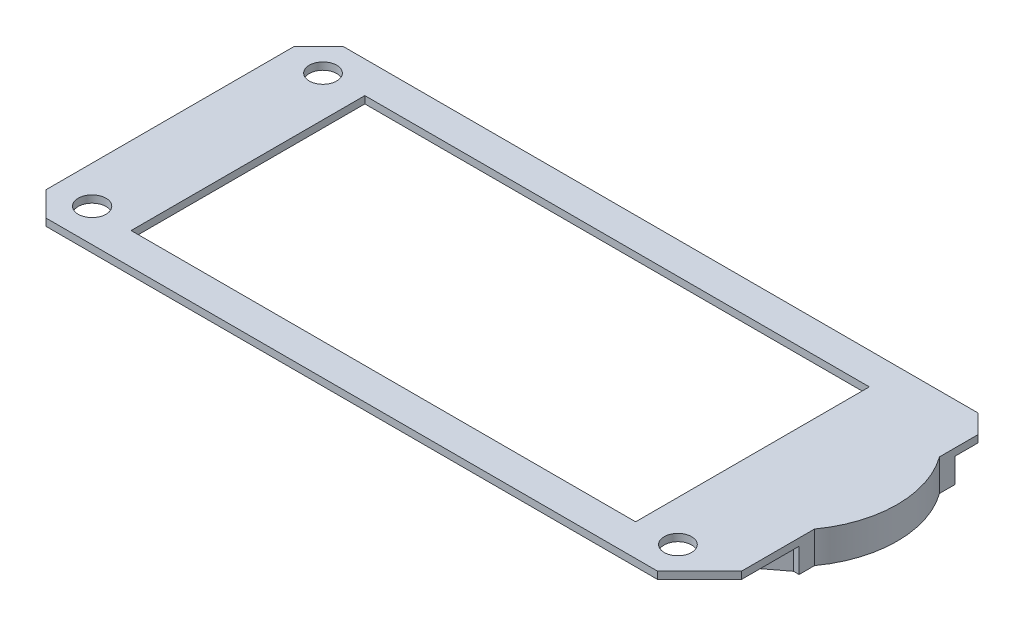
ISO-10303-21;
HEADER;
FILE_DESCRIPTION(('STEP AP214'),'2;1');
FILE_NAME('part.step','',(''),(''),'','','');
FILE_SCHEMA(('AUTOMOTIVE_DESIGN { 1 0 10303 214 1 1 1 1 }'));
ENDSEC;
DATA;
#1=APPLICATION_CONTEXT('core data for automotive mechanical design processes');
#2=APPLICATION_PROTOCOL_DEFINITION('international standard','automotive_design',2000,#1);
#3=PRODUCT_CONTEXT('',#1,'mechanical');
#4=PRODUCT('Part','Part','',(#3));
#5=PRODUCT_RELATED_PRODUCT_CATEGORY('part','',(#4));
#6=PRODUCT_DEFINITION_FORMATION('','',#4);
#7=PRODUCT_DEFINITION_CONTEXT('part definition',#1,'design');
#8=PRODUCT_DEFINITION('design','',#6,#7);
#9=PRODUCT_DEFINITION_SHAPE('','',#8);
#10=(LENGTH_UNIT() NAMED_UNIT(*) SI_UNIT(.MILLI.,.METRE.));
#11=(NAMED_UNIT(*) PLANE_ANGLE_UNIT() SI_UNIT($,.RADIAN.));
#12=(NAMED_UNIT(*) SI_UNIT($,.STERADIAN.) SOLID_ANGLE_UNIT());
#13=UNCERTAINTY_MEASURE_WITH_UNIT(LENGTH_MEASURE(1.E-05),#10,'distance_accuracy_value','');
#14=(GEOMETRIC_REPRESENTATION_CONTEXT(3) GLOBAL_UNCERTAINTY_ASSIGNED_CONTEXT((#13)) GLOBAL_UNIT_ASSIGNED_CONTEXT((#10,
#11,#12)) REPRESENTATION_CONTEXT('',''));
#15=CARTESIAN_POINT('',(0.,0.,0.));
#16=DIRECTION('',(0.,0.,1.));
#17=DIRECTION('',(1.,0.,0.));
#18=AXIS2_PLACEMENT_3D('',#15,#16,#17);
#19=CARTESIAN_POINT('',(-19.3118277968053,0.5,0.));
#20=DIRECTION('',(1.,0.,0.));
#21=DIRECTION('',(0.,0.,-1.));
#22=AXIS2_PLACEMENT_3D('',#19,#20,#21);
#23=PLANE('',#22);
#24=DIRECTION('',(0.,0.,1.));
#25=VECTOR('',#24,1.);
#26=CARTESIAN_POINT('',(-19.3118277968053,0.,0.));
#27=LINE('',#26,#25);
#28=CARTESIAN_POINT('',(-19.3118277968053,0.,-8.35591389840265));
#29=VERTEX_POINT('',#28);
#30=CARTESIAN_POINT('',(-19.3118277968053,0.,7.84408610159735));
#31=VERTEX_POINT('',#30);
#32=EDGE_CURVE('E390',#29,#31,#27,.T.);
#33=ORIENTED_EDGE('',*,*,#32,.F.);
#34=DIRECTION('',(0.,-1.,0.));
#35=VECTOR('',#34,1.);
#36=CARTESIAN_POINT('',(-19.3118277968053,0.5,-8.35591389840265));
#37=LINE('',#36,#35);
#38=CARTESIAN_POINT('',(-19.3118277968053,0.5,-8.35591389840265));
#39=VERTEX_POINT('',#38);
#40=EDGE_CURVE('E11',#39,#29,#37,.T.);
#41=ORIENTED_EDGE('',*,*,#40,.F.);
#42=DIRECTION('',(0.,0.,1.));
#43=VECTOR('',#42,1.);
#44=CARTESIAN_POINT('',(-19.3118277968053,0.5,0.));
#45=LINE('',#44,#43);
#46=CARTESIAN_POINT('',(-19.3118277968053,0.5,7.84408610159735));
#47=VERTEX_POINT('',#46);
#48=EDGE_CURVE('E361',#39,#47,#45,.T.);
#49=ORIENTED_EDGE('',*,*,#48,.T.);
#50=DIRECTION('',(0.,-1.,0.));
#51=VECTOR('',#50,1.);
#52=CARTESIAN_POINT('',(-19.3118277968053,0.5,7.84408610159735));
#53=LINE('',#52,#51);
#54=EDGE_CURVE('E225',#47,#31,#53,.T.);
#55=ORIENTED_EDGE('',*,*,#54,.T.);
#56=EDGE_LOOP('',(#33,#41,#49,#55));
#57=FACE_BOUND('',#56,.T.);
#58=ADVANCED_FACE('F37',(#57),#23,.T.);
#59=CARTESIAN_POINT('',(0.,0.5,-8.35591389840265));
#60=DIRECTION('',(0.,0.,1.));
#61=DIRECTION('',(1.,0.,0.));
#62=AXIS2_PLACEMENT_3D('',#59,#60,#61);
#63=PLANE('',#62);
#64=DIRECTION('',(-1.,0.,0.));
#65=VECTOR('',#64,1.);
#66=CARTESIAN_POINT('',(0.,0.,-8.35591389840265));
#67=LINE('',#66,#65);
#68=CARTESIAN_POINT('',(15.6554741861121,0.,-8.35591389840265));
#69=VERTEX_POINT('',#68);
#70=EDGE_CURVE('E393',#69,#29,#67,.T.);
#71=ORIENTED_EDGE('',*,*,#70,.F.);
#72=DIRECTION('',(0.,-1.,0.));
#73=VECTOR('',#72,1.);
#74=CARTESIAN_POINT('',(15.6554741861121,0.5,-8.35591389840265));
#75=LINE('',#74,#73);
#76=CARTESIAN_POINT('',(15.6554741861121,0.5,-8.35591389840265));
#77=VERTEX_POINT('',#76);
#78=EDGE_CURVE('E46',#77,#69,#75,.T.);
#79=ORIENTED_EDGE('',*,*,#78,.F.);
#80=DIRECTION('',(-1.,0.,0.));
#81=VECTOR('',#80,1.);
#82=CARTESIAN_POINT('',(0.,0.5,-8.35591389840265));
#83=LINE('',#82,#81);
#84=EDGE_CURVE('E364',#77,#39,#83,.T.);
#85=ORIENTED_EDGE('',*,*,#84,.T.);
#86=ORIENTED_EDGE('',*,*,#40,.T.);
#87=EDGE_LOOP('',(#71,#79,#85,#86));
#88=FACE_BOUND('',#87,.T.);
#89=ADVANCED_FACE('F528',(#88),#63,.T.);
#90=CARTESIAN_POINT('',(15.6554741861121,0.5,0.));
#91=DIRECTION('',(1.,0.,0.));
#92=DIRECTION('',(0.,0.,-1.));
#93=AXIS2_PLACEMENT_3D('',#90,#91,#92);
#94=PLANE('',#93);
#95=DIRECTION('',(0.,0.,1.));
#96=VECTOR('',#95,1.);
#97=CARTESIAN_POINT('',(15.6554741861121,0.,0.));
#98=LINE('',#97,#96);
#99=CARTESIAN_POINT('',(15.6554741861121,0.,7.84408610159735));
#100=VERTEX_POINT('',#99);
#101=EDGE_CURVE('E396',#69,#100,#98,.T.);
#102=ORIENTED_EDGE('',*,*,#101,.T.);
#103=DIRECTION('',(0.,-1.,0.));
#104=VECTOR('',#103,1.);
#105=CARTESIAN_POINT('',(15.6554741861121,0.5,7.84408610159735));
#106=LINE('',#105,#104);
#107=CARTESIAN_POINT('',(15.6554741861121,0.5,7.84408610159735));
#108=VERTEX_POINT('',#107);
#109=EDGE_CURVE('E402',#108,#100,#106,.T.);
#110=ORIENTED_EDGE('',*,*,#109,.F.);
#111=DIRECTION('',(0.,0.,1.));
#112=VECTOR('',#111,1.);
#113=CARTESIAN_POINT('',(15.6554741861121,0.5,0.));
#114=LINE('',#113,#112);
#115=EDGE_CURVE('E367',#77,#108,#114,.T.);
#116=ORIENTED_EDGE('',*,*,#115,.F.);
#117=ORIENTED_EDGE('',*,*,#78,.T.);
#118=EDGE_LOOP('',(#102,#110,#116,#117));
#119=FACE_BOUND('',#118,.T.);
#120=ADVANCED_FACE('F533',(#119),#94,.F.);
#121=CARTESIAN_POINT('',(22.2881722031947,0.5,0.));
#122=DIRECTION('',(-1.,0.,0.));
#123=DIRECTION('',(0.,0.,1.));
#124=AXIS2_PLACEMENT_3D('',#121,#122,#123);
#125=PLANE('',#124);
#126=DIRECTION('',(0.,0.,-1.));
#127=VECTOR('',#126,1.);
#128=CARTESIAN_POINT('',(22.2881722031947,0.,0.));
#129=LINE('',#128,#127);
#130=CARTESIAN_POINT('',(22.2881722031947,0.,7.14408610159735));
#131=VERTEX_POINT('',#130);
#132=CARTESIAN_POINT('',(22.2881722031947,0.,3.14408610159735));
#133=VERTEX_POINT('',#132);
#134=EDGE_CURVE('E307',#131,#133,#129,.T.);
#135=ORIENTED_EDGE('',*,*,#134,.T.);
#136=DIRECTION('',(0.,1.,0.));
#137=VECTOR('',#136,1.);
#138=CARTESIAN_POINT('',(22.2881722031947,-1.7,3.14408610159735));
#139=LINE('',#138,#137);
#140=CARTESIAN_POINT('',(22.2881722031947,-1.7,3.14408610159735));
#141=VERTEX_POINT('',#140);
#142=EDGE_CURVE('E238',#141,#133,#139,.T.);
#143=ORIENTED_EDGE('',*,*,#142,.F.);
#144=DIRECTION('',(0.,0.,-1.));
#145=VECTOR('',#144,1.);
#146=CARTESIAN_POINT('',(22.2881722031947,-1.7,0.));
#147=LINE('',#146,#145);
#148=CARTESIAN_POINT('',(22.2881722031947,-1.7,2.07536766713885));
#149=VERTEX_POINT('',#148);
#150=EDGE_CURVE('E231',#141,#149,#147,.T.);
#151=ORIENTED_EDGE('',*,*,#150,.T.);
#152=DIRECTION('',(0.,-1.,0.));
#153=VECTOR('',#152,1.);
#154=CARTESIAN_POINT('',(22.2881722031947,0.5,2.07536766713885));
#155=LINE('',#154,#153);
#156=CARTESIAN_POINT('',(22.2881722031947,0.5,2.07536766713885));
#157=VERTEX_POINT('',#156);
#158=EDGE_CURVE('E41',#157,#149,#155,.T.);
#159=ORIENTED_EDGE('',*,*,#158,.F.);
#160=DIRECTION('',(0.,0.,-1.));
#161=VECTOR('',#160,1.);
#162=CARTESIAN_POINT('',(22.2881722031947,0.5,0.));
#163=LINE('',#162,#161);
#164=CARTESIAN_POINT('',(22.2881722031947,0.5,7.14408610159735));
#165=VERTEX_POINT('',#164);
#166=EDGE_CURVE('E341',#165,#157,#163,.T.);
#167=ORIENTED_EDGE('',*,*,#166,.F.);
#168=DIRECTION('',(0.,-1.,0.));
#169=VECTOR('',#168,1.);
#170=CARTESIAN_POINT('',(22.2881722031947,0.5,7.14408610159735));
#171=LINE('',#170,#169);
#172=EDGE_CURVE('E372',#165,#131,#171,.T.);
#173=ORIENTED_EDGE('',*,*,#172,.T.);
#174=EDGE_LOOP('',(#135,#143,#151,#159,#167,#173));
#175=FACE_BOUND('',#174,.T.);
#176=ADVANCED_FACE('F39',(#175),#125,.F.);
#177=CARTESIAN_POINT('',(16.2881722031947,0.5,-2.25591389840268));
#178=DIRECTION('',(0.,-1.,0.));
#179=DIRECTION('',(0.,0.,-1.));
#180=AXIS2_PLACEMENT_3D('',#177,#178,#179);
#181=CYLINDRICAL_SURFACE('',#180,7.39999999999999);
#182=ORIENTED_EDGE('',*,*,#158,.T.);
#183=CARTESIAN_POINT('',(16.2881722031947,-1.7,-2.25591389840268));
#184=DIRECTION('',(0.,1.,0.));
#185=DIRECTION('',(0.,0.,1.));
#186=AXIS2_PLACEMENT_3D('',#183,#184,#185);
#187=CIRCLE('',#186,7.39999999999999);
#188=CARTESIAN_POINT('',(22.2881722031947,-1.7,-6.58719546394421));
#189=VERTEX_POINT('',#188);
#190=EDGE_CURVE('E219',#149,#189,#187,.T.);
#191=ORIENTED_EDGE('',*,*,#190,.T.);
#192=DIRECTION('',(0.,-1.,0.));
#193=VECTOR('',#192,1.);
#194=CARTESIAN_POINT('',(22.2881722031947,0.5,-6.58719546394421));
#195=LINE('',#194,#193);
#196=CARTESIAN_POINT('',(22.2881722031947,0.5,-6.58719546394421));
#197=VERTEX_POINT('',#196);
#198=EDGE_CURVE('E226',#197,#189,#195,.T.);
#199=ORIENTED_EDGE('',*,*,#198,.F.);
#200=CARTESIAN_POINT('',(16.2881722031947,0.5,-2.25591389840268));
#201=DIRECTION('',(0.,1.,0.));
#202=DIRECTION('',(0.,0.,1.));
#203=AXIS2_PLACEMENT_3D('',#200,#201,#202);
#204=CIRCLE('',#203,7.39999999999999);
#205=EDGE_CURVE('E220',#157,#197,#204,.T.);
#206=ORIENTED_EDGE('',*,*,#205,.F.);
#207=EDGE_LOOP('',(#182,#191,#199,#206));
#208=FACE_BOUND('',#207,.T.);
#209=ADVANCED_FACE('F217',(#208),#181,.T.);
#210=CARTESIAN_POINT('',(22.2881722031947,0.5,0.));
#211=DIRECTION('',(-1.,0.,0.));
#212=DIRECTION('',(0.,0.,1.));
#213=AXIS2_PLACEMENT_3D('',#210,#211,#212);
#214=PLANE('',#213);
#215=ORIENTED_EDGE('',*,*,#198,.T.);
#216=DIRECTION('',(0.,0.,1.));
#217=VECTOR('',#216,1.);
#218=CARTESIAN_POINT('',(22.2881722031947,-1.7,0.));
#219=LINE('',#218,#217);
#220=CARTESIAN_POINT('',(22.2881722031947,-1.7,-7.65591389840265));
#221=VERTEX_POINT('',#220);
#222=EDGE_CURVE('E234',#221,#189,#219,.T.);
#223=ORIENTED_EDGE('',*,*,#222,.F.);
#224=DIRECTION('',(0.,1.,0.));
#225=VECTOR('',#224,1.);
#226=CARTESIAN_POINT('',(22.2881722031947,-1.7,-7.65591389840265));
#227=LINE('',#226,#225);
#228=CARTESIAN_POINT('',(22.2881722031947,0.,-7.65591389840265));
#229=VERTEX_POINT('',#228);
#230=EDGE_CURVE('E284',#221,#229,#227,.T.);
#231=ORIENTED_EDGE('',*,*,#230,.T.);
#232=DIRECTION('',(0.,0.,-1.));
#233=VECTOR('',#232,1.);
#234=CARTESIAN_POINT('',(22.2881722031947,0.,0.));
#235=LINE('',#234,#233);
#236=CARTESIAN_POINT('',(22.2881722031947,0.,-9.25591389840265));
#237=VERTEX_POINT('',#236);
#238=EDGE_CURVE('E374',#229,#237,#235,.T.);
#239=ORIENTED_EDGE('',*,*,#238,.T.);
#240=DIRECTION('',(0.,-1.,0.));
#241=VECTOR('',#240,1.);
#242=CARTESIAN_POINT('',(22.2881722031947,0.5,-9.25591389840265));
#243=LINE('',#242,#241);
#244=CARTESIAN_POINT('',(22.2881722031947,0.5,-9.25591389840265));
#245=VERTEX_POINT('',#244);
#246=EDGE_CURVE('E426',#245,#237,#243,.T.);
#247=ORIENTED_EDGE('',*,*,#246,.F.);
#248=DIRECTION('',(0.,0.,-1.));
#249=VECTOR('',#248,1.);
#250=CARTESIAN_POINT('',(22.2881722031947,0.5,0.));
#251=LINE('',#250,#249);
#252=EDGE_CURVE('E345',#197,#245,#251,.T.);
#253=ORIENTED_EDGE('',*,*,#252,.F.);
#254=EDGE_LOOP('',(#215,#223,#231,#239,#247,#253));
#255=FACE_BOUND('',#254,.T.);
#256=ADVANCED_FACE('F430',(#255),#214,.F.);
#257=CARTESIAN_POINT('',(15.7720430507987,0.5,-15.7720430507987));
#258=DIRECTION('',(-0.707106781186547,0.,0.707106781186548));
#259=DIRECTION('',(0.707106781186548,0.,0.707106781186547));
#260=AXIS2_PLACEMENT_3D('',#257,#258,#259);
#261=PLANE('',#260);
#262=DIRECTION('',(-0.707106781186548,0.,-0.707106781186547));
#263=VECTOR('',#262,1.);
#264=CARTESIAN_POINT('',(15.7720430507987,0.,-15.7720430507987));
#265=LINE('',#264,#263);
#266=CARTESIAN_POINT('',(20.9881722031947,0.,-10.5559138984027));
#267=VERTEX_POINT('',#266);
#268=EDGE_CURVE('E376',#237,#267,#265,.T.);
#269=ORIENTED_EDGE('',*,*,#268,.T.);
#270=DIRECTION('',(0.,-1.,0.));
#271=VECTOR('',#270,1.);
#272=CARTESIAN_POINT('',(20.9881722031947,0.5,-10.5559138984027));
#273=LINE('',#272,#271);
#274=CARTESIAN_POINT('',(20.9881722031947,0.5,-10.5559138984027));
#275=VERTEX_POINT('',#274);
#276=EDGE_CURVE('E423',#275,#267,#273,.T.);
#277=ORIENTED_EDGE('',*,*,#276,.F.);
#278=DIRECTION('',(-0.707106781186548,0.,-0.707106781186547));
#279=VECTOR('',#278,1.);
#280=CARTESIAN_POINT('',(15.7720430507987,0.5,-15.7720430507987));
#281=LINE('',#280,#279);
#282=EDGE_CURVE('E347',#245,#275,#281,.T.);
#283=ORIENTED_EDGE('',*,*,#282,.F.);
#284=ORIENTED_EDGE('',*,*,#246,.T.);
#285=EDGE_LOOP('',(#269,#277,#283,#284));
#286=FACE_BOUND('',#285,.T.);
#287=ADVANCED_FACE('F490',(#286),#261,.F.);
#288=CARTESIAN_POINT('',(0.,0.5,-10.5559138984027));
#289=DIRECTION('',(0.,0.,1.));
#290=DIRECTION('',(1.,0.,0.));
#291=AXIS2_PLACEMENT_3D('',#288,#289,#290);
#292=PLANE('',#291);
#293=DIRECTION('',(-1.,0.,0.));
#294=VECTOR('',#293,1.);
#295=CARTESIAN_POINT('',(0.,0.,-10.5559138984027));
#296=LINE('',#295,#294);
#297=CARTESIAN_POINT('',(-23.0118277968053,0.,-10.5559138984027));
#298=VERTEX_POINT('',#297);
#299=EDGE_CURVE('E378',#267,#298,#296,.T.);
#300=ORIENTED_EDGE('',*,*,#299,.T.);
#301=DIRECTION('',(0.,-1.,0.));
#302=VECTOR('',#301,1.);
#303=CARTESIAN_POINT('',(-23.0118277968053,0.5,-10.5559138984027));
#304=LINE('',#303,#302);
#305=CARTESIAN_POINT('',(-23.0118277968053,0.5,-10.5559138984027));
#306=VERTEX_POINT('',#305);
#307=EDGE_CURVE('E420',#306,#298,#304,.T.);
#308=ORIENTED_EDGE('',*,*,#307,.F.);
#309=DIRECTION('',(-1.,0.,0.));
#310=VECTOR('',#309,1.);
#311=CARTESIAN_POINT('',(0.,0.5,-10.5559138984027));
#312=LINE('',#311,#310);
#313=EDGE_CURVE('E349',#275,#306,#312,.T.);
#314=ORIENTED_EDGE('',*,*,#313,.F.);
#315=ORIENTED_EDGE('',*,*,#276,.T.);
#316=EDGE_LOOP('',(#300,#308,#314,#315));
#317=FACE_BOUND('',#316,.T.);
#318=ADVANCED_FACE('F496',(#317),#292,.F.);
#319=CARTESIAN_POINT('',(-16.7838708476039,0.5,-16.783870847604));
#320=DIRECTION('',(0.707106781186547,0.,0.707106781186548));
#321=DIRECTION('',(0.707106781186548,0.,-0.707106781186547));
#322=AXIS2_PLACEMENT_3D('',#319,#320,#321);
#323=PLANE('',#322);
#324=DIRECTION('',(-0.707106781186548,0.,0.707106781186547));
#325=VECTOR('',#324,1.);
#326=CARTESIAN_POINT('',(-16.7838708476039,0.,-16.783870847604));
#327=LINE('',#326,#325);
#328=CARTESIAN_POINT('',(-24.7118277968053,0.,-8.85591389840265));
#329=VERTEX_POINT('',#328);
#330=EDGE_CURVE('E380',#298,#329,#327,.T.);
#331=ORIENTED_EDGE('',*,*,#330,.T.);
#332=DIRECTION('',(0.,-1.,0.));
#333=VECTOR('',#332,1.);
#334=CARTESIAN_POINT('',(-24.7118277968053,0.5,-8.85591389840265));
#335=LINE('',#334,#333);
#336=CARTESIAN_POINT('',(-24.7118277968053,0.5,-8.85591389840265));
#337=VERTEX_POINT('',#336);
#338=EDGE_CURVE('E417',#337,#329,#335,.T.);
#339=ORIENTED_EDGE('',*,*,#338,.F.);
#340=DIRECTION('',(-0.707106781186548,0.,0.707106781186547));
#341=VECTOR('',#340,1.);
#342=CARTESIAN_POINT('',(-16.7838708476039,0.5,-16.783870847604));
#343=LINE('',#342,#341);
#344=EDGE_CURVE('E351',#306,#337,#343,.T.);
#345=ORIENTED_EDGE('',*,*,#344,.F.);
#346=ORIENTED_EDGE('',*,*,#307,.T.);
#347=EDGE_LOOP('',(#331,#339,#345,#346));
#348=FACE_BOUND('',#347,.T.);
#349=ADVANCED_FACE('F500',(#348),#323,.F.);
#350=CARTESIAN_POINT('',(-24.7118277968053,0.5,0.));
#351=DIRECTION('',(1.,0.,0.));
#352=DIRECTION('',(0.,0.,-1.));
#353=AXIS2_PLACEMENT_3D('',#350,#351,#352);
#354=PLANE('',#353);
#355=DIRECTION('',(0.,0.,1.));
#356=VECTOR('',#355,1.);
#357=CARTESIAN_POINT('',(-24.7118277968053,0.,0.));
#358=LINE('',#357,#356);
#359=CARTESIAN_POINT('',(-24.7118277968053,0.,8.34408610159735));
#360=VERTEX_POINT('',#359);
#361=EDGE_CURVE('E382',#329,#360,#358,.T.);
#362=ORIENTED_EDGE('',*,*,#361,.T.);
#363=DIRECTION('',(0.,-1.,0.));
#364=VECTOR('',#363,1.);
#365=CARTESIAN_POINT('',(-24.7118277968053,0.5,8.34408610159735));
#366=LINE('',#365,#364);
#367=CARTESIAN_POINT('',(-24.7118277968053,0.5,8.34408610159735));
#368=VERTEX_POINT('',#367);
#369=EDGE_CURVE('E414',#368,#360,#366,.T.);
#370=ORIENTED_EDGE('',*,*,#369,.F.);
#371=DIRECTION('',(0.,0.,1.));
#372=VECTOR('',#371,1.);
#373=CARTESIAN_POINT('',(-24.7118277968053,0.5,0.));
#374=LINE('',#373,#372);
#375=EDGE_CURVE('E353',#337,#368,#374,.T.);
#376=ORIENTED_EDGE('',*,*,#375,.F.);
#377=ORIENTED_EDGE('',*,*,#338,.T.);
#378=EDGE_LOOP('',(#362,#370,#376,#377));
#379=FACE_BOUND('',#378,.T.);
#380=ADVANCED_FACE('F507',(#379),#354,.F.);
#381=CARTESIAN_POINT('',(-16.5279569492013,0.5,16.5279569492013));
#382=DIRECTION('',(0.707106781186546,0.,-0.707106781186549));
#383=DIRECTION('',(-0.707106781186549,0.,-0.707106781186546));
#384=AXIS2_PLACEMENT_3D('',#381,#382,#383);
#385=PLANE('',#384);
#386=DIRECTION('',(0.707106781186549,0.,0.707106781186546));
#387=VECTOR('',#386,1.);
#388=CARTESIAN_POINT('',(-16.5279569492013,0.,16.5279569492013));
#389=LINE('',#388,#387);
#390=CARTESIAN_POINT('',(-23.0118277968053,0.,10.0440861015973));
#391=VERTEX_POINT('',#390);
#392=EDGE_CURVE('E384',#360,#391,#389,.T.);
#393=ORIENTED_EDGE('',*,*,#392,.T.);
#394=DIRECTION('',(0.,-1.,0.));
#395=VECTOR('',#394,1.);
#396=CARTESIAN_POINT('',(-23.0118277968053,0.5,10.0440861015973));
#397=LINE('',#396,#395);
#398=CARTESIAN_POINT('',(-23.0118277968053,0.5,10.0440861015973));
#399=VERTEX_POINT('',#398);
#400=EDGE_CURVE('E411',#399,#391,#397,.T.);
#401=ORIENTED_EDGE('',*,*,#400,.F.);
#402=DIRECTION('',(0.707106781186549,0.,0.707106781186546));
#403=VECTOR('',#402,1.);
#404=CARTESIAN_POINT('',(-16.5279569492013,0.5,16.5279569492013));
#405=LINE('',#404,#403);
#406=EDGE_CURVE('E355',#368,#399,#405,.T.);
#407=ORIENTED_EDGE('',*,*,#406,.F.);
#408=ORIENTED_EDGE('',*,*,#369,.T.);
#409=EDGE_LOOP('',(#393,#401,#407,#408));
#410=FACE_BOUND('',#409,.T.);
#411=ADVANCED_FACE('F510',(#410),#385,.F.);
#412=CARTESIAN_POINT('',(0.,0.5,10.0440861015973));
#413=DIRECTION('',(0.,0.,-1.));
#414=DIRECTION('',(-1.,0.,0.));
#415=AXIS2_PLACEMENT_3D('',#412,#413,#414);
#416=PLANE('',#415);
#417=DIRECTION('',(1.,0.,0.));
#418=VECTOR('',#417,1.);
#419=CARTESIAN_POINT('',(0.,0.,10.0440861015973));
#420=LINE('',#419,#418);
#421=CARTESIAN_POINT('',(19.3881722031947,0.,10.0440861015973));
#422=VERTEX_POINT('',#421);
#423=EDGE_CURVE('E386',#391,#422,#420,.T.);
#424=ORIENTED_EDGE('',*,*,#423,.T.);
#425=DIRECTION('',(0.,-1.,0.));
#426=VECTOR('',#425,1.);
#427=CARTESIAN_POINT('',(19.3881722031947,0.5,10.0440861015973));
#428=LINE('',#427,#426);
#429=CARTESIAN_POINT('',(19.3881722031947,0.5,10.0440861015973));
#430=VERTEX_POINT('',#429);
#431=EDGE_CURVE('E408',#430,#422,#428,.T.);
#432=ORIENTED_EDGE('',*,*,#431,.F.);
#433=DIRECTION('',(1.,0.,0.));
#434=VECTOR('',#433,1.);
#435=CARTESIAN_POINT('',(0.,0.5,10.0440861015973));
#436=LINE('',#435,#434);
#437=EDGE_CURVE('E357',#399,#430,#436,.T.);
#438=ORIENTED_EDGE('',*,*,#437,.F.);
#439=ORIENTED_EDGE('',*,*,#400,.T.);
#440=EDGE_LOOP('',(#424,#432,#438,#439));
#441=FACE_BOUND('',#440,.T.);
#442=ADVANCED_FACE('F514',(#441),#416,.F.);
#443=CARTESIAN_POINT('',(14.716129152396,0.5,14.716129152396));
#444=DIRECTION('',(-0.707106781186548,0.,-0.707106781186547));
#445=DIRECTION('',(-0.707106781186547,0.,0.707106781186548));
#446=AXIS2_PLACEMENT_3D('',#443,#444,#445);
#447=PLANE('',#446);
#448=DIRECTION('',(0.707106781186547,0.,-0.707106781186548));
#449=VECTOR('',#448,1.);
#450=CARTESIAN_POINT('',(14.716129152396,0.,14.716129152396));
#451=LINE('',#450,#449);
#452=EDGE_CURVE('E388',#422,#131,#451,.T.);
#453=ORIENTED_EDGE('',*,*,#452,.T.);
#454=ORIENTED_EDGE('',*,*,#172,.F.);
#455=DIRECTION('',(0.707106781186547,0.,-0.707106781186548));
#456=VECTOR('',#455,1.);
#457=CARTESIAN_POINT('',(14.716129152396,0.5,14.716129152396));
#458=LINE('',#457,#456);
#459=EDGE_CURVE('E359',#430,#165,#458,.T.);
#460=ORIENTED_EDGE('',*,*,#459,.F.);
#461=ORIENTED_EDGE('',*,*,#431,.T.);
#462=EDGE_LOOP('',(#453,#454,#460,#461));
#463=FACE_BOUND('',#462,.T.);
#464=ADVANCED_FACE('F515',(#463),#447,.F.);
#465=CARTESIAN_POINT('',(0.,0.5,7.84408610159735));
#466=DIRECTION('',(0.,0.,1.));
#467=DIRECTION('',(1.,0.,0.));
#468=AXIS2_PLACEMENT_3D('',#465,#466,#467);
#469=PLANE('',#468);
#470=DIRECTION('',(-1.,0.,0.));
#471=VECTOR('',#470,1.);
#472=CARTESIAN_POINT('',(0.,0.,7.84408610159735));
#473=LINE('',#472,#471);
#474=EDGE_CURVE('E343',#100,#31,#473,.T.);
#475=ORIENTED_EDGE('',*,*,#474,.T.);
#476=ORIENTED_EDGE('',*,*,#54,.F.);
#477=DIRECTION('',(-1.,0.,0.));
#478=VECTOR('',#477,1.);
#479=CARTESIAN_POINT('',(0.,0.5,7.84408610159735));
#480=LINE('',#479,#478);
#481=EDGE_CURVE('E370',#108,#47,#480,.T.);
#482=ORIENTED_EDGE('',*,*,#481,.F.);
#483=ORIENTED_EDGE('',*,*,#109,.T.);
#484=EDGE_LOOP('',(#475,#476,#482,#483));
#485=FACE_BOUND('',#484,.T.);
#486=ADVANCED_FACE('F517',(#485),#469,.F.);
#487=CARTESIAN_POINT('',(0.,0.5,0.));
#488=DIRECTION('',(0.,1.,0.));
#489=DIRECTION('',(0.,0.,1.));
#490=AXIS2_PLACEMENT_3D('',#487,#488,#489);
#491=PLANE('',#490);
#492=CARTESIAN_POINT('',(-22.1118277968053,0.5,-8.25591389840265));
#493=DIRECTION('',(0.,1.,0.));
#494=DIRECTION('',(0.,0.,1.));
#495=AXIS2_PLACEMENT_3D('',#492,#493,#494);
#496=CIRCLE('',#495,0.950019994063512);
#497=CARTESIAN_POINT('',(-22.1118277968053,0.5,-7.30589390433914));
#498=VERTEX_POINT('',#497);
#499=EDGE_CURVE('E286',#498,#498,#496,.T.);
#500=ORIENTED_EDGE('',*,*,#499,.F.);
#501=EDGE_LOOP('',(#500));
#502=FACE_BOUND('',#501,.T.);
#503=CARTESIAN_POINT('',(-22.1237193510419,0.5,7.73688044226178));
#504=DIRECTION('',(0.,1.,0.));
#505=DIRECTION('',(0.,0.,1.));
#506=AXIS2_PLACEMENT_3D('',#503,#504,#505);
#507=CIRCLE('',#506,0.963923891545964);
#508=CARTESIAN_POINT('',(-22.1237193510419,0.5,8.70080433380775));
#509=VERTEX_POINT('',#508);
#510=EDGE_CURVE('E597',#509,#509,#507,.T.);
#511=ORIENTED_EDGE('',*,*,#510,.F.);
#512=EDGE_LOOP('',(#511));
#513=FACE_BOUND('',#512,.T.);
#514=CARTESIAN_POINT('',(18.4881910887041,0.5,7.74409266666491));
#515=DIRECTION('',(0.,1.,0.));
#516=DIRECTION('',(0.,0.,1.));
#517=AXIS2_PLACEMENT_3D('',#514,#515,#516);
#518=CIRCLE('',#517,0.950000000000004);
#519=CARTESIAN_POINT('',(18.4881910887041,0.5,8.69409266666491));
#520=VERTEX_POINT('',#519);
#521=EDGE_CURVE('E246',#520,#520,#518,.T.);
#522=ORIENTED_EDGE('',*,*,#521,.F.);
#523=EDGE_LOOP('',(#522));
#524=FACE_BOUND('',#523,.T.);
#525=ORIENTED_EDGE('',*,*,#166,.T.);
#526=ORIENTED_EDGE('',*,*,#205,.T.);
#527=ORIENTED_EDGE('',*,*,#252,.T.);
#528=ORIENTED_EDGE('',*,*,#282,.T.);
#529=ORIENTED_EDGE('',*,*,#313,.T.);
#530=ORIENTED_EDGE('',*,*,#344,.T.);
#531=ORIENTED_EDGE('',*,*,#375,.T.);
#532=ORIENTED_EDGE('',*,*,#406,.T.);
#533=ORIENTED_EDGE('',*,*,#437,.T.);
#534=ORIENTED_EDGE('',*,*,#459,.T.);
#535=EDGE_LOOP('',(#525,#526,#527,#528,#529,#530,#531,#532,#533,#534));
#536=FACE_BOUND('',#535,.T.);
#537=ORIENTED_EDGE('',*,*,#48,.F.);
#538=ORIENTED_EDGE('',*,*,#84,.F.);
#539=ORIENTED_EDGE('',*,*,#115,.T.);
#540=ORIENTED_EDGE('',*,*,#481,.T.);
#541=EDGE_LOOP('',(#537,#538,#539,#540));
#542=FACE_BOUND('',#541,.T.);
#543=ADVANCED_FACE('F434',(#502,#513,#524,#536,#542),#491,.T.);
#544=CARTESIAN_POINT('',(0.,0.,0.));
#545=DIRECTION('',(0.,1.,0.));
#546=DIRECTION('',(0.,0.,1.));
#547=AXIS2_PLACEMENT_3D('',#544,#545,#546);
#548=PLANE('',#547);
#549=CARTESIAN_POINT('',(-22.1118277968053,0.,-8.25591389840265));
#550=DIRECTION('',(0.,1.,0.));
#551=DIRECTION('',(0.,0.,1.));
#552=AXIS2_PLACEMENT_3D('',#549,#550,#551);
#553=CIRCLE('',#552,0.950019994063512);
#554=CARTESIAN_POINT('',(-22.1118277968053,0.,-7.30589390433914));
#555=VERTEX_POINT('',#554);
#556=EDGE_CURVE('E592',#555,#555,#553,.T.);
#557=ORIENTED_EDGE('',*,*,#556,.T.);
#558=EDGE_LOOP('',(#557));
#559=FACE_BOUND('',#558,.T.);
#560=CARTESIAN_POINT('',(-22.1237193510419,0.,7.73688044226178));
#561=DIRECTION('',(0.,1.,0.));
#562=DIRECTION('',(0.,0.,1.));
#563=AXIS2_PLACEMENT_3D('',#560,#561,#562);
#564=CIRCLE('',#563,0.963923891545964);
#565=CARTESIAN_POINT('',(-22.1237193510419,0.,8.70080433380775));
#566=VERTEX_POINT('',#565);
#567=EDGE_CURVE('E593',#566,#566,#564,.T.);
#568=ORIENTED_EDGE('',*,*,#567,.T.);
#569=EDGE_LOOP('',(#568));
#570=FACE_BOUND('',#569,.T.);
#571=CARTESIAN_POINT('',(18.4881910887041,0.,7.74409266666491));
#572=DIRECTION('',(0.,1.,0.));
#573=DIRECTION('',(0.,0.,1.));
#574=AXIS2_PLACEMENT_3D('',#571,#572,#573);
#575=CIRCLE('',#574,0.950000000000004);
#576=CARTESIAN_POINT('',(18.4881910887041,0.,8.69409266666491));
#577=VERTEX_POINT('',#576);
#578=EDGE_CURVE('E601',#577,#577,#575,.T.);
#579=ORIENTED_EDGE('',*,*,#578,.T.);
#580=EDGE_LOOP('',(#579));
#581=FACE_BOUND('',#580,.T.);
#582=ORIENTED_EDGE('',*,*,#238,.F.);
#583=DIRECTION('',(-1.,0.,0.));
#584=VECTOR('',#583,1.);
#585=CARTESIAN_POINT('',(0.,0.,-7.65591389840265));
#586=LINE('',#585,#584);
#587=CARTESIAN_POINT('',(21.9311178538186,0.,-7.65591389840265));
#588=VERTEX_POINT('',#587);
#589=EDGE_CURVE('E54',#229,#588,#586,.T.);
#590=ORIENTED_EDGE('',*,*,#589,.T.);
#591=DIRECTION('',(-0.780641375370431,0.,-0.624979234102831));
#592=VECTOR('',#591,1.);
#593=CARTESIAN_POINT('',(12.3014765111713,0.,-15.3653769897701));
#594=LINE('',#593,#592);
#595=CARTESIAN_POINT('',(20.4322366121254,0.,-8.85591389840265));
#596=VERTEX_POINT('',#595);
#597=EDGE_CURVE('E59',#588,#596,#594,.T.);
#598=ORIENTED_EDGE('',*,*,#597,.T.);
#599=DIRECTION('',(-1.,0.,0.));
#600=VECTOR('',#599,1.);
#601=CARTESIAN_POINT('',(0.,0.,-8.85591389840265));
#602=LINE('',#601,#600);
#603=CARTESIAN_POINT('',(18.4881722031947,0.,-8.85591389840265));
#604=VERTEX_POINT('',#603);
#605=EDGE_CURVE('E288',#596,#604,#602,.T.);
#606=ORIENTED_EDGE('',*,*,#605,.T.);
#607=DIRECTION('',(0.,0.,1.));
#608=VECTOR('',#607,1.);
#609=CARTESIAN_POINT('',(18.4881722031947,0.,0.));
#610=LINE('',#609,#608);
#611=CARTESIAN_POINT('',(18.4881722031947,0.,-7.88860252298391));
#612=VERTEX_POINT('',#611);
#613=EDGE_CURVE('E290',#604,#612,#610,.T.);
#614=ORIENTED_EDGE('',*,*,#613,.T.);
#615=DIRECTION('',(-0.986544977166096,0.,-0.163490085412991));
#616=VECTOR('',#615,1.);
#617=CARTESIAN_POINT('',(1.7665257488912,0.,-10.6597112613944));
#618=LINE('',#617,#616);
#619=CARTESIAN_POINT('',(16.2554741861121,0.,-8.25860490296947));
#620=VERTEX_POINT('',#619);
#621=EDGE_CURVE('E292',#612,#620,#618,.T.);
#622=ORIENTED_EDGE('',*,*,#621,.T.);
#623=DIRECTION('',(0.,0.,1.));
#624=VECTOR('',#623,1.);
#625=CARTESIAN_POINT('',(16.2554741861121,0.,0.));
#626=LINE('',#625,#624);
#627=CARTESIAN_POINT('',(16.2554741861121,0.,4.54408610159735));
#628=VERTEX_POINT('',#627);
#629=EDGE_CURVE('E294',#620,#628,#626,.T.);
#630=ORIENTED_EDGE('',*,*,#629,.T.);
#631=DIRECTION('',(1.,0.,0.));
#632=VECTOR('',#631,1.);
#633=CARTESIAN_POINT('',(0.,0.,4.54408610159735));
#634=LINE('',#633,#632);
#635=CARTESIAN_POINT('',(19.0284575323195,0.,4.54408610159735));
#636=VERTEX_POINT('',#635);
#637=EDGE_CURVE('E296',#628,#636,#634,.T.);
#638=ORIENTED_EDGE('',*,*,#637,.T.);
#639=DIRECTION('',(0.,0.,1.));
#640=VECTOR('',#639,1.);
#641=CARTESIAN_POINT('',(19.0284575323195,0.,0.));
#642=LINE('',#641,#640);
#643=CARTESIAN_POINT('',(19.0284575323195,0.,5.54408610159735));
#644=VERTEX_POINT('',#643);
#645=EDGE_CURVE('E298',#636,#644,#642,.T.);
#646=ORIENTED_EDGE('',*,*,#645,.T.);
#647=DIRECTION('',(1.,0.,0.));
#648=VECTOR('',#647,1.);
#649=CARTESIAN_POINT('',(0.,0.,5.54408610159735));
#650=LINE('',#649,#648);
#651=CARTESIAN_POINT('',(19.9284575323195,0.,5.54408610159735));
#652=VERTEX_POINT('',#651);
#653=EDGE_CURVE('E300',#644,#652,#650,.T.);
#654=ORIENTED_EDGE('',*,*,#653,.T.);
#655=DIRECTION('',(0.,0.,-1.));
#656=VECTOR('',#655,1.);
#657=CARTESIAN_POINT('',(19.9284575323195,0.,0.));
#658=LINE('',#657,#656);
#659=CARTESIAN_POINT('',(19.9284575323195,0.,4.64494444911279));
#660=VERTEX_POINT('',#659);
#661=EDGE_CURVE('E302',#652,#660,#658,.T.);
#662=ORIENTED_EDGE('',*,*,#661,.T.);
#663=DIRECTION('',(-0.795853969912677,0.,0.605488611432315));
#664=VECTOR('',#663,1.);
#665=CARTESIAN_POINT('',(9.54440874930584,0.,12.5451667466308));
#666=LINE('',#665,#664);
#667=CARTESIAN_POINT('',(21.9011850974527,0.,3.14408610159735));
#668=VERTEX_POINT('',#667);
#669=EDGE_CURVE('E243',#668,#660,#666,.T.);
#670=ORIENTED_EDGE('',*,*,#669,.F.);
#671=DIRECTION('',(-1.,0.,0.));
#672=VECTOR('',#671,1.);
#673=CARTESIAN_POINT('',(0.,0.,3.14408610159735));
#674=LINE('',#673,#672);
#675=EDGE_CURVE('E240',#133,#668,#674,.T.);
#676=ORIENTED_EDGE('',*,*,#675,.F.);
#677=ORIENTED_EDGE('',*,*,#134,.F.);
#678=ORIENTED_EDGE('',*,*,#452,.F.);
#679=ORIENTED_EDGE('',*,*,#423,.F.);
#680=ORIENTED_EDGE('',*,*,#392,.F.);
#681=ORIENTED_EDGE('',*,*,#361,.F.);
#682=ORIENTED_EDGE('',*,*,#330,.F.);
#683=ORIENTED_EDGE('',*,*,#299,.F.);
#684=ORIENTED_EDGE('',*,*,#268,.F.);
#685=EDGE_LOOP('',(#582,#590,#598,#606,#614,#622,#630,#638,#646,#654,#662,#670,#676,#677,#678,
#679,#680,#681,#682,#683,#684));
#686=FACE_BOUND('',#685,.T.);
#687=ORIENTED_EDGE('',*,*,#32,.T.);
#688=ORIENTED_EDGE('',*,*,#474,.F.);
#689=ORIENTED_EDGE('',*,*,#101,.F.);
#690=ORIENTED_EDGE('',*,*,#70,.T.);
#691=EDGE_LOOP('',(#687,#688,#689,#690));
#692=FACE_BOUND('',#691,.T.);
#693=ADVANCED_FACE('F442',(#559,#570,#581,#686,#692),#548,.F.);
#694=CARTESIAN_POINT('',(0.,-1.7,3.14408610159735));
#695=DIRECTION('',(0.,0.,-1.));
#696=DIRECTION('',(-1.,0.,0.));
#697=AXIS2_PLACEMENT_3D('',#694,#695,#696);
#698=PLANE('',#697);
#699=ORIENTED_EDGE('',*,*,#675,.T.);
#700=DIRECTION('',(0.,1.,0.));
#701=VECTOR('',#700,1.);
#702=CARTESIAN_POINT('',(21.9011850974527,-1.7,3.14408610159735));
#703=LINE('',#702,#701);
#704=CARTESIAN_POINT('',(21.9011850974527,-1.7,3.14408610159735));
#705=VERTEX_POINT('',#704);
#706=EDGE_CURVE('E308',#705,#668,#703,.T.);
#707=ORIENTED_EDGE('',*,*,#706,.F.);
#708=DIRECTION('',(-1.,0.,0.));
#709=VECTOR('',#708,1.);
#710=CARTESIAN_POINT('',(0.,-1.7,3.14408610159735));
#711=LINE('',#710,#709);
#712=EDGE_CURVE('E282',#141,#705,#711,.T.);
#713=ORIENTED_EDGE('',*,*,#712,.F.);
#714=ORIENTED_EDGE('',*,*,#142,.T.);
#715=EDGE_LOOP('',(#699,#707,#713,#714));
#716=FACE_BOUND('',#715,.T.);
#717=ADVANCED_FACE('F447',(#716),#698,.F.);
#718=CARTESIAN_POINT('',(9.54440874930584,-1.7,12.5451667466308));
#719=DIRECTION('',(-0.605488611432315,0.,-0.795853969912677));
#720=DIRECTION('',(-0.795853969912677,0.,0.605488611432315));
#721=AXIS2_PLACEMENT_3D('',#718,#719,#720);
#722=PLANE('',#721);
#723=ORIENTED_EDGE('',*,*,#669,.T.);
#724=DIRECTION('',(0.,1.,0.));
#725=VECTOR('',#724,1.);
#726=CARTESIAN_POINT('',(19.9284575323195,-1.7,4.64494444911279));
#727=LINE('',#726,#725);
#728=CARTESIAN_POINT('',(19.9284575323195,-1.7,4.64494444911279));
#729=VERTEX_POINT('',#728);
#730=EDGE_CURVE('E311',#729,#660,#727,.T.);
#731=ORIENTED_EDGE('',*,*,#730,.F.);
#732=DIRECTION('',(-0.795853969912677,0.,0.605488611432315));
#733=VECTOR('',#732,1.);
#734=CARTESIAN_POINT('',(9.54440874930584,-1.7,12.5451667466308));
#735=LINE('',#734,#733);
#736=EDGE_CURVE('E280',#705,#729,#735,.T.);
#737=ORIENTED_EDGE('',*,*,#736,.F.);
#738=ORIENTED_EDGE('',*,*,#706,.T.);
#739=EDGE_LOOP('',(#723,#731,#737,#738));
#740=FACE_BOUND('',#739,.T.);
#741=ADVANCED_FACE('F450',(#740),#722,.F.);
#742=CARTESIAN_POINT('',(19.9284575323195,-1.7,0.));
#743=DIRECTION('',(1.,0.,0.));
#744=DIRECTION('',(0.,0.,-1.));
#745=AXIS2_PLACEMENT_3D('',#742,#743,#744);
#746=PLANE('',#745);
#747=ORIENTED_EDGE('',*,*,#661,.F.);
#748=DIRECTION('',(0.,1.,0.));
#749=VECTOR('',#748,1.);
#750=CARTESIAN_POINT('',(19.9284575323195,-1.7,5.54408610159735));
#751=LINE('',#750,#749);
#752=CARTESIAN_POINT('',(19.9284575323195,-1.7,5.54408610159735));
#753=VERTEX_POINT('',#752);
#754=EDGE_CURVE('E314',#753,#652,#751,.T.);
#755=ORIENTED_EDGE('',*,*,#754,.F.);
#756=DIRECTION('',(0.,0.,-1.));
#757=VECTOR('',#756,1.);
#758=CARTESIAN_POINT('',(19.9284575323195,-1.7,0.));
#759=LINE('',#758,#757);
#760=EDGE_CURVE('E277',#753,#729,#759,.T.);
#761=ORIENTED_EDGE('',*,*,#760,.T.);
#762=ORIENTED_EDGE('',*,*,#730,.T.);
#763=EDGE_LOOP('',(#747,#755,#761,#762));
#764=FACE_BOUND('',#763,.T.);
#765=ADVANCED_FACE('F565',(#764),#746,.T.);
#766=CARTESIAN_POINT('',(0.,-1.7,5.54408610159735));
#767=DIRECTION('',(0.,0.,1.));
#768=DIRECTION('',(1.,0.,0.));
#769=AXIS2_PLACEMENT_3D('',#766,#767,#768);
#770=PLANE('',#769);
#771=ORIENTED_EDGE('',*,*,#653,.F.);
#772=DIRECTION('',(0.,1.,0.));
#773=VECTOR('',#772,1.);
#774=CARTESIAN_POINT('',(19.0284575323195,-1.7,5.54408610159735));
#775=LINE('',#774,#773);
#776=CARTESIAN_POINT('',(19.0284575323195,-1.7,5.54408610159735));
#777=VERTEX_POINT('',#776);
#778=EDGE_CURVE('E317',#777,#644,#775,.T.);
#779=ORIENTED_EDGE('',*,*,#778,.F.);
#780=DIRECTION('',(1.,0.,0.));
#781=VECTOR('',#780,1.);
#782=CARTESIAN_POINT('',(0.,-1.7,5.54408610159735));
#783=LINE('',#782,#781);
#784=EDGE_CURVE('E274',#777,#753,#783,.T.);
#785=ORIENTED_EDGE('',*,*,#784,.T.);
#786=ORIENTED_EDGE('',*,*,#754,.T.);
#787=EDGE_LOOP('',(#771,#779,#785,#786));
#788=FACE_BOUND('',#787,.T.);
#789=ADVANCED_FACE('F458',(#788),#770,.T.);
#790=CARTESIAN_POINT('',(19.0284575323195,-1.7,0.));
#791=DIRECTION('',(-1.,0.,0.));
#792=DIRECTION('',(0.,0.,1.));
#793=AXIS2_PLACEMENT_3D('',#790,#791,#792);
#794=PLANE('',#793);
#795=ORIENTED_EDGE('',*,*,#645,.F.);
#796=DIRECTION('',(0.,1.,0.));
#797=VECTOR('',#796,1.);
#798=CARTESIAN_POINT('',(19.0284575323195,-1.7,4.54408610159735));
#799=LINE('',#798,#797);
#800=CARTESIAN_POINT('',(19.0284575323195,-1.7,4.54408610159735));
#801=VERTEX_POINT('',#800);
#802=EDGE_CURVE('E320',#801,#636,#799,.T.);
#803=ORIENTED_EDGE('',*,*,#802,.F.);
#804=DIRECTION('',(0.,0.,1.));
#805=VECTOR('',#804,1.);
#806=CARTESIAN_POINT('',(19.0284575323195,-1.7,0.));
#807=LINE('',#806,#805);
#808=EDGE_CURVE('E271',#801,#777,#807,.T.);
#809=ORIENTED_EDGE('',*,*,#808,.T.);
#810=ORIENTED_EDGE('',*,*,#778,.T.);
#811=EDGE_LOOP('',(#795,#803,#809,#810));
#812=FACE_BOUND('',#811,.T.);
#813=ADVANCED_FACE('F462',(#812),#794,.T.);
#814=CARTESIAN_POINT('',(0.,-1.7,4.54408610159735));
#815=DIRECTION('',(0.,0.,1.));
#816=DIRECTION('',(1.,0.,0.));
#817=AXIS2_PLACEMENT_3D('',#814,#815,#816);
#818=PLANE('',#817);
#819=ORIENTED_EDGE('',*,*,#637,.F.);
#820=DIRECTION('',(0.,1.,0.));
#821=VECTOR('',#820,1.);
#822=CARTESIAN_POINT('',(16.2554741861121,-1.7,4.54408610159735));
#823=LINE('',#822,#821);
#824=CARTESIAN_POINT('',(16.2554741861121,-1.7,4.54408610159735));
#825=VERTEX_POINT('',#824);
#826=EDGE_CURVE('E323',#825,#628,#823,.T.);
#827=ORIENTED_EDGE('',*,*,#826,.F.);
#828=DIRECTION('',(1.,0.,0.));
#829=VECTOR('',#828,1.);
#830=CARTESIAN_POINT('',(0.,-1.7,4.54408610159735));
#831=LINE('',#830,#829);
#832=EDGE_CURVE('E268',#825,#801,#831,.T.);
#833=ORIENTED_EDGE('',*,*,#832,.T.);
#834=ORIENTED_EDGE('',*,*,#802,.T.);
#835=EDGE_LOOP('',(#819,#827,#833,#834));
#836=FACE_BOUND('',#835,.T.);
#837=ADVANCED_FACE('F467',(#836),#818,.T.);
#838=CARTESIAN_POINT('',(16.2554741861121,-1.7,0.));
#839=DIRECTION('',(-1.,0.,0.));
#840=DIRECTION('',(0.,0.,1.));
#841=AXIS2_PLACEMENT_3D('',#838,#839,#840);
#842=PLANE('',#841);
#843=ORIENTED_EDGE('',*,*,#629,.F.);
#844=DIRECTION('',(0.,1.,0.));
#845=VECTOR('',#844,1.);
#846=CARTESIAN_POINT('',(16.2554741861121,-1.7,-8.25860490296947));
#847=LINE('',#846,#845);
#848=CARTESIAN_POINT('',(16.2554741861121,-1.7,-8.25860490296947));
#849=VERTEX_POINT('',#848);
#850=EDGE_CURVE('E326',#849,#620,#847,.T.);
#851=ORIENTED_EDGE('',*,*,#850,.F.);
#852=DIRECTION('',(0.,0.,1.));
#853=VECTOR('',#852,1.);
#854=CARTESIAN_POINT('',(16.2554741861121,-1.7,0.));
#855=LINE('',#854,#853);
#856=EDGE_CURVE('E265',#849,#825,#855,.T.);
#857=ORIENTED_EDGE('',*,*,#856,.T.);
#858=ORIENTED_EDGE('',*,*,#826,.T.);
#859=EDGE_LOOP('',(#843,#851,#857,#858));
#860=FACE_BOUND('',#859,.T.);
#861=ADVANCED_FACE('F470',(#860),#842,.T.);
#862=CARTESIAN_POINT('',(1.7665257488912,-1.7,-10.6597112613944));
#863=DIRECTION('',(0.163490085412991,0.,-0.986544977166096));
#864=DIRECTION('',(-0.986544977166096,0.,-0.163490085412991));
#865=AXIS2_PLACEMENT_3D('',#862,#863,#864);
#866=PLANE('',#865);
#867=ORIENTED_EDGE('',*,*,#621,.F.);
#868=DIRECTION('',(0.,1.,0.));
#869=VECTOR('',#868,1.);
#870=CARTESIAN_POINT('',(18.4881722031947,-1.7,-7.88860252298391));
#871=LINE('',#870,#869);
#872=CARTESIAN_POINT('',(18.4881722031947,-1.7,-7.88860252298391));
#873=VERTEX_POINT('',#872);
#874=EDGE_CURVE('E329',#873,#612,#871,.T.);
#875=ORIENTED_EDGE('',*,*,#874,.F.);
#876=DIRECTION('',(-0.986544977166096,0.,-0.163490085412991));
#877=VECTOR('',#876,1.);
#878=CARTESIAN_POINT('',(1.7665257488912,-1.7,-10.6597112613944));
#879=LINE('',#878,#877);
#880=EDGE_CURVE('E262',#873,#849,#879,.T.);
#881=ORIENTED_EDGE('',*,*,#880,.T.);
#882=ORIENTED_EDGE('',*,*,#850,.T.);
#883=EDGE_LOOP('',(#867,#875,#881,#882));
#884=FACE_BOUND('',#883,.T.);
#885=ADVANCED_FACE('F475',(#884),#866,.T.);
#886=CARTESIAN_POINT('',(18.4881722031947,-1.7,0.));
#887=DIRECTION('',(-1.,0.,0.));
#888=DIRECTION('',(0.,0.,1.));
#889=AXIS2_PLACEMENT_3D('',#886,#887,#888);
#890=PLANE('',#889);
#891=ORIENTED_EDGE('',*,*,#613,.F.);
#892=DIRECTION('',(0.,1.,0.));
#893=VECTOR('',#892,1.);
#894=CARTESIAN_POINT('',(18.4881722031947,-1.7,-8.85591389840265));
#895=LINE('',#894,#893);
#896=CARTESIAN_POINT('',(18.4881722031947,-1.7,-8.85591389840265));
#897=VERTEX_POINT('',#896);
#898=EDGE_CURVE('E332',#897,#604,#895,.T.);
#899=ORIENTED_EDGE('',*,*,#898,.F.);
#900=DIRECTION('',(0.,0.,1.));
#901=VECTOR('',#900,1.);
#902=CARTESIAN_POINT('',(18.4881722031947,-1.7,0.));
#903=LINE('',#902,#901);
#904=EDGE_CURVE('E259',#897,#873,#903,.T.);
#905=ORIENTED_EDGE('',*,*,#904,.T.);
#906=ORIENTED_EDGE('',*,*,#874,.T.);
#907=EDGE_LOOP('',(#891,#899,#905,#906));
#908=FACE_BOUND('',#907,.T.);
#909=ADVANCED_FACE('F478',(#908),#890,.T.);
#910=CARTESIAN_POINT('',(0.,-1.7,-8.85591389840265));
#911=DIRECTION('',(0.,0.,-1.));
#912=DIRECTION('',(-1.,0.,0.));
#913=AXIS2_PLACEMENT_3D('',#910,#911,#912);
#914=PLANE('',#913);
#915=ORIENTED_EDGE('',*,*,#605,.F.);
#916=DIRECTION('',(0.,1.,0.));
#917=VECTOR('',#916,1.);
#918=CARTESIAN_POINT('',(20.4322366121254,-1.7,-8.85591389840265));
#919=LINE('',#918,#917);
#920=CARTESIAN_POINT('',(20.4322366121254,-1.7,-8.85591389840265));
#921=VERTEX_POINT('',#920);
#922=EDGE_CURVE('E335',#921,#596,#919,.T.);
#923=ORIENTED_EDGE('',*,*,#922,.F.);
#924=DIRECTION('',(-1.,0.,0.));
#925=VECTOR('',#924,1.);
#926=CARTESIAN_POINT('',(0.,-1.7,-8.85591389840265));
#927=LINE('',#926,#925);
#928=EDGE_CURVE('E256',#921,#897,#927,.T.);
#929=ORIENTED_EDGE('',*,*,#928,.T.);
#930=ORIENTED_EDGE('',*,*,#898,.T.);
#931=EDGE_LOOP('',(#915,#923,#929,#930));
#932=FACE_BOUND('',#931,.T.);
#933=ADVANCED_FACE('F483',(#932),#914,.T.);
#934=CARTESIAN_POINT('',(12.3014765111713,-1.7,-15.3653769897701));
#935=DIRECTION('',(0.624979234102831,0.,-0.780641375370431));
#936=DIRECTION('',(-0.780641375370431,0.,-0.624979234102831));
#937=AXIS2_PLACEMENT_3D('',#934,#935,#936);
#938=PLANE('',#937);
#939=ORIENTED_EDGE('',*,*,#597,.F.);
#940=DIRECTION('',(0.,1.,0.));
#941=VECTOR('',#940,1.);
#942=CARTESIAN_POINT('',(21.9311178538186,-1.7,-7.65591389840265));
#943=LINE('',#942,#941);
#944=CARTESIAN_POINT('',(21.9311178538186,-1.7,-7.65591389840265));
#945=VERTEX_POINT('',#944);
#946=EDGE_CURVE('E337',#945,#588,#943,.T.);
#947=ORIENTED_EDGE('',*,*,#946,.F.);
#948=DIRECTION('',(-0.780641375370431,0.,-0.624979234102831));
#949=VECTOR('',#948,1.);
#950=CARTESIAN_POINT('',(12.3014765111713,-1.7,-15.3653769897701));
#951=LINE('',#950,#949);
#952=EDGE_CURVE('E253',#945,#921,#951,.T.);
#953=ORIENTED_EDGE('',*,*,#952,.T.);
#954=ORIENTED_EDGE('',*,*,#922,.T.);
#955=EDGE_LOOP('',(#939,#947,#953,#954));
#956=FACE_BOUND('',#955,.T.);
#957=ADVANCED_FACE('F485',(#956),#938,.T.);
#958=CARTESIAN_POINT('',(0.,-1.7,-7.65591389840265));
#959=DIRECTION('',(0.,0.,-1.));
#960=DIRECTION('',(-1.,0.,0.));
#961=AXIS2_PLACEMENT_3D('',#958,#959,#960);
#962=PLANE('',#961);
#963=ORIENTED_EDGE('',*,*,#589,.F.);
#964=ORIENTED_EDGE('',*,*,#230,.F.);
#965=DIRECTION('',(-1.,0.,0.));
#966=VECTOR('',#965,1.);
#967=CARTESIAN_POINT('',(0.,-1.7,-7.65591389840265));
#968=LINE('',#967,#966);
#969=EDGE_CURVE('E250',#221,#945,#968,.T.);
#970=ORIENTED_EDGE('',*,*,#969,.T.);
#971=ORIENTED_EDGE('',*,*,#946,.T.);
#972=EDGE_LOOP('',(#963,#964,#970,#971));
#973=FACE_BOUND('',#972,.T.);
#974=ADVANCED_FACE('F487',(#973),#962,.T.);
#975=CARTESIAN_POINT('',(0.,-1.7,0.));
#976=DIRECTION('',(0.,1.,0.));
#977=DIRECTION('',(0.,0.,1.));
#978=AXIS2_PLACEMENT_3D('',#975,#976,#977);
#979=PLANE('',#978);
#980=ORIENTED_EDGE('',*,*,#150,.F.);
#981=ORIENTED_EDGE('',*,*,#712,.T.);
#982=ORIENTED_EDGE('',*,*,#736,.T.);
#983=ORIENTED_EDGE('',*,*,#760,.F.);
#984=ORIENTED_EDGE('',*,*,#784,.F.);
#985=ORIENTED_EDGE('',*,*,#808,.F.);
#986=ORIENTED_EDGE('',*,*,#832,.F.);
#987=ORIENTED_EDGE('',*,*,#856,.F.);
#988=ORIENTED_EDGE('',*,*,#880,.F.);
#989=ORIENTED_EDGE('',*,*,#904,.F.);
#990=ORIENTED_EDGE('',*,*,#928,.F.);
#991=ORIENTED_EDGE('',*,*,#952,.F.);
#992=ORIENTED_EDGE('',*,*,#969,.F.);
#993=ORIENTED_EDGE('',*,*,#222,.T.);
#994=ORIENTED_EDGE('',*,*,#190,.F.);
#995=EDGE_LOOP('',(#980,#981,#982,#983,#984,#985,#986,#987,#988,#989,#990,#991,#992,#993,#994));
#996=FACE_BOUND('',#995,.T.);
#997=ADVANCED_FACE('F230',(#996),#979,.F.);
#998=CARTESIAN_POINT('',(18.4881910887041,0.5,7.74409266666491));
#999=DIRECTION('',(0.,-1.,0.));
#1000=DIRECTION('',(0.,0.,-1.));
#1001=AXIS2_PLACEMENT_3D('',#998,#999,#1000);
#1002=CYLINDRICAL_SURFACE('',#1001,0.950000000000004);
#1003=ORIENTED_EDGE('',*,*,#521,.T.);
#1004=EDGE_LOOP('',(#1003));
#1005=FACE_BOUND('',#1004,.T.);
#1006=ORIENTED_EDGE('',*,*,#578,.F.);
#1007=EDGE_LOOP('',(#1006));
#1008=FACE_BOUND('',#1007,.T.);
#1009=ADVANCED_FACE('F574',(#1005,#1008),#1002,.F.);
#1010=CARTESIAN_POINT('',(-22.1237193510419,0.5,7.73688044226178));
#1011=DIRECTION('',(0.,-1.,0.));
#1012=DIRECTION('',(0.,0.,-1.));
#1013=AXIS2_PLACEMENT_3D('',#1010,#1011,#1012);
#1014=CYLINDRICAL_SURFACE('',#1013,0.963923891545964);
#1015=ORIENTED_EDGE('',*,*,#510,.T.);
#1016=EDGE_LOOP('',(#1015));
#1017=FACE_BOUND('',#1016,.T.);
#1018=ORIENTED_EDGE('',*,*,#567,.F.);
#1019=EDGE_LOOP('',(#1018));
#1020=FACE_BOUND('',#1019,.T.);
#1021=ADVANCED_FACE('F577',(#1017,#1020),#1014,.F.);
#1022=CARTESIAN_POINT('',(-22.1118277968053,0.5,-8.25591389840265));
#1023=DIRECTION('',(0.,-1.,0.));
#1024=DIRECTION('',(0.,0.,-1.));
#1025=AXIS2_PLACEMENT_3D('',#1022,#1023,#1024);
#1026=CYLINDRICAL_SURFACE('',#1025,0.950019994063512);
#1027=ORIENTED_EDGE('',*,*,#499,.T.);
#1028=EDGE_LOOP('',(#1027));
#1029=FACE_BOUND('',#1028,.T.);
#1030=ORIENTED_EDGE('',*,*,#556,.F.);
#1031=EDGE_LOOP('',(#1030));
#1032=FACE_BOUND('',#1031,.T.);
#1033=ADVANCED_FACE('F581',(#1029,#1032),#1026,.F.);
#1034=CLOSED_SHELL('',(#58,#89,#120,#176,#209,#256,#287,#318,#349,#380,#411,#442,#464,#486,#543,
#693,#717,#741,#765,#789,#813,#837,#861,#885,#909,#933,#957,#974,#997,#1009,#1021,#1033));
#1035=MANIFOLD_SOLID_BREP('B2',#1034);
#1036=ADVANCED_BREP_SHAPE_REPRESENTATION('',(#18,#1035),#14);
#1037=SHAPE_DEFINITION_REPRESENTATION(#9,#1036);
ENDSEC;
END-ISO-10303-21;
